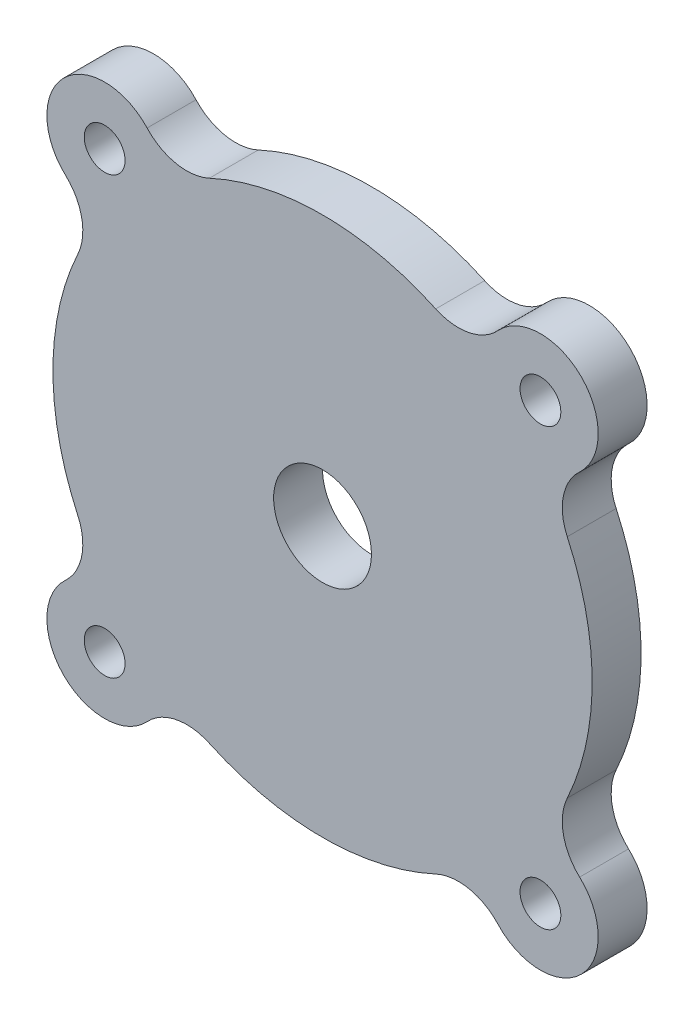
ISO-10303-21;
HEADER;
FILE_DESCRIPTION(('STEP AP214'),'2;1');
FILE_NAME('part.step','',(''),(''),'','','');
FILE_SCHEMA(('AUTOMOTIVE_DESIGN { 1 0 10303 214 1 1 1 1 }'));
ENDSEC;
DATA;
#1=APPLICATION_CONTEXT('core data for automotive mechanical design processes');
#2=APPLICATION_PROTOCOL_DEFINITION('international standard','automotive_design',2000,#1);
#3=PRODUCT_CONTEXT('',#1,'mechanical');
#4=PRODUCT('Part','Part','',(#3));
#5=PRODUCT_RELATED_PRODUCT_CATEGORY('part','',(#4));
#6=PRODUCT_DEFINITION_FORMATION('','',#4);
#7=PRODUCT_DEFINITION_CONTEXT('part definition',#1,'design');
#8=PRODUCT_DEFINITION('design','',#6,#7);
#9=PRODUCT_DEFINITION_SHAPE('','',#8);
#10=(LENGTH_UNIT() NAMED_UNIT(*) SI_UNIT(.MILLI.,.METRE.));
#11=(NAMED_UNIT(*) PLANE_ANGLE_UNIT() SI_UNIT($,.RADIAN.));
#12=(NAMED_UNIT(*) SI_UNIT($,.STERADIAN.) SOLID_ANGLE_UNIT());
#13=UNCERTAINTY_MEASURE_WITH_UNIT(LENGTH_MEASURE(1.E-05),#10,'distance_accuracy_value','');
#14=(GEOMETRIC_REPRESENTATION_CONTEXT(3) GLOBAL_UNCERTAINTY_ASSIGNED_CONTEXT((#13)) GLOBAL_UNIT_ASSIGNED_CONTEXT((#10,
#11,#12)) REPRESENTATION_CONTEXT('',''));
#15=CARTESIAN_POINT('',(0.,0.,0.));
#16=DIRECTION('',(0.,0.,1.));
#17=DIRECTION('',(1.,0.,0.));
#18=AXIS2_PLACEMENT_3D('',#15,#16,#17);
#19=CARTESIAN_POINT('',(0.,0.,3.175));
#20=DIRECTION('',(0.,0.,-1.));
#21=DIRECTION('',(-1.,0.,0.));
#22=AXIS2_PLACEMENT_3D('',#19,#20,#21);
#23=CYLINDRICAL_SURFACE('',#22,35.);
#24=CARTESIAN_POINT('',(0.,0.,3.175));
#25=DIRECTION('',(0.,0.,1.));
#26=DIRECTION('',(-1.,0.,0.));
#27=AXIS2_PLACEMENT_3D('',#24,#25,#26);
#28=CIRCLE('',#27,35.);
#29=CARTESIAN_POINT('',(14.6921496209077,31.7669756117396,3.175));
#30=VERTEX_POINT('',#29);
#31=CARTESIAN_POINT('',(-14.6921496209078,31.7669756117396,3.175));
#32=VERTEX_POINT('',#31);
#33=EDGE_CURVE('E197',#30,#32,#28,.T.);
#34=ORIENTED_EDGE('',*,*,#33,.F.);
#35=DIRECTION('',(0.,0.,-1.));
#36=VECTOR('',#35,1.);
#37=CARTESIAN_POINT('',(14.6921496209077,31.7669756117396,3.175));
#38=LINE('',#37,#36);
#39=CARTESIAN_POINT('',(14.6921496209077,31.7669756117396,-3.175));
#40=VERTEX_POINT('',#39);
#41=EDGE_CURVE('E159',#30,#40,#38,.T.);
#42=ORIENTED_EDGE('',*,*,#41,.T.);
#43=CARTESIAN_POINT('',(0.,0.,-3.175));
#44=DIRECTION('',(0.,0.,1.));
#45=DIRECTION('',(-1.,0.,0.));
#46=AXIS2_PLACEMENT_3D('',#43,#44,#45);
#47=CIRCLE('',#46,35.);
#48=CARTESIAN_POINT('',(-14.6921496209078,31.7669756117396,-3.175));
#49=VERTEX_POINT('',#48);
#50=EDGE_CURVE('E182',#40,#49,#47,.T.);
#51=ORIENTED_EDGE('',*,*,#50,.T.);
#52=DIRECTION('',(0.,0.,-1.));
#53=VECTOR('',#52,1.);
#54=CARTESIAN_POINT('',(-14.6921496209078,31.7669756117396,3.175));
#55=LINE('',#54,#53);
#56=EDGE_CURVE('E49',#49,#32,#55,.F.);
#57=ORIENTED_EDGE('',*,*,#56,.T.);
#58=EDGE_LOOP('',(#34,#42,#51,#57));
#59=FACE_BOUND('',#58,.T.);
#60=ADVANCED_FACE('F34',(#59),#23,.T.);
#61=CARTESIAN_POINT('',(-28.2842712474619,28.2842712474619,3.175));
#62=DIRECTION('',(0.,0.,-1.));
#63=DIRECTION('',(-1.,0.,0.));
#64=AXIS2_PLACEMENT_3D('',#61,#62,#63);
#65=CYLINDRICAL_SURFACE('',#64,7.50000000000001);
#66=CARTESIAN_POINT('',(-28.2842712474619,28.2842712474619,-3.175));
#67=DIRECTION('',(0.,0.,1.));
#68=DIRECTION('',(1.,0.,0.));
#69=AXIS2_PLACEMENT_3D('',#66,#67,#68);
#70=CIRCLE('',#69,7.50000000000001);
#71=CARTESIAN_POINT('',(-22.7737410565795,33.3719089129579,-3.175));
#72=VERTEX_POINT('',#71);
#73=CARTESIAN_POINT('',(-33.3719089129579,22.7737410565795,-3.175));
#74=VERTEX_POINT('',#73);
#75=EDGE_CURVE('E177',#72,#74,#70,.T.);
#76=ORIENTED_EDGE('',*,*,#75,.T.);
#77=DIRECTION('',(0.,0.,-1.));
#78=VECTOR('',#77,1.);
#79=CARTESIAN_POINT('',(-33.3719089129579,22.7737410565795,3.175));
#80=LINE('',#79,#78);
#81=CARTESIAN_POINT('',(-33.3719089129579,22.7737410565795,3.175));
#82=VERTEX_POINT('',#81);
#83=EDGE_CURVE('E153',#74,#82,#80,.F.);
#84=ORIENTED_EDGE('',*,*,#83,.T.);
#85=CARTESIAN_POINT('',(-28.2842712474619,28.2842712474619,3.175));
#86=DIRECTION('',(0.,0.,1.));
#87=DIRECTION('',(1.,0.,0.));
#88=AXIS2_PLACEMENT_3D('',#85,#86,#87);
#89=CIRCLE('',#88,7.50000000000001);
#90=CARTESIAN_POINT('',(-22.7737410565795,33.3719089129579,3.175));
#91=VERTEX_POINT('',#90);
#92=EDGE_CURVE('E261',#91,#82,#89,.T.);
#93=ORIENTED_EDGE('',*,*,#92,.F.);
#94=DIRECTION('',(0.,0.,-1.));
#95=VECTOR('',#94,1.);
#96=CARTESIAN_POINT('',(-22.7737410565795,33.3719089129579,3.175));
#97=LINE('',#96,#95);
#98=EDGE_CURVE('E169',#91,#72,#97,.T.);
#99=ORIENTED_EDGE('',*,*,#98,.T.);
#100=EDGE_LOOP('',(#76,#84,#93,#99));
#101=FACE_BOUND('',#100,.T.);
#102=ADVANCED_FACE('F263',(#101),#65,.T.);
#103=CARTESIAN_POINT('',(0.,0.,3.175));
#104=DIRECTION('',(0.,0.,-1.));
#105=DIRECTION('',(-1.,0.,0.));
#106=AXIS2_PLACEMENT_3D('',#103,#104,#105);
#107=CYLINDRICAL_SURFACE('',#106,35.);
#108=CARTESIAN_POINT('',(0.,0.,3.175));
#109=DIRECTION('',(0.,0.,1.));
#110=DIRECTION('',(-1.,0.,0.));
#111=AXIS2_PLACEMENT_3D('',#108,#109,#110);
#112=CIRCLE('',#111,35.);
#113=CARTESIAN_POINT('',(-31.7669756117396,14.6921496209078,3.175));
#114=VERTEX_POINT('',#113);
#115=CARTESIAN_POINT('',(-31.7669756117396,-14.6921496209078,3.175));
#116=VERTEX_POINT('',#115);
#117=EDGE_CURVE('E168',#114,#116,#112,.T.);
#118=ORIENTED_EDGE('',*,*,#117,.F.);
#119=DIRECTION('',(0.,0.,-1.));
#120=VECTOR('',#119,1.);
#121=CARTESIAN_POINT('',(-31.7669756117396,14.6921496209078,3.175));
#122=LINE('',#121,#120);
#123=CARTESIAN_POINT('',(-31.7669756117396,14.6921496209078,-3.175));
#124=VERTEX_POINT('',#123);
#125=EDGE_CURVE('E152',#114,#124,#122,.T.);
#126=ORIENTED_EDGE('',*,*,#125,.T.);
#127=CARTESIAN_POINT('',(0.,0.,-3.175));
#128=DIRECTION('',(0.,0.,1.));
#129=DIRECTION('',(-1.,0.,0.));
#130=AXIS2_PLACEMENT_3D('',#127,#128,#129);
#131=CIRCLE('',#130,35.);
#132=CARTESIAN_POINT('',(-31.7669756117396,-14.6921496209078,-3.175));
#133=VERTEX_POINT('',#132);
#134=EDGE_CURVE('E165',#124,#133,#131,.T.);
#135=ORIENTED_EDGE('',*,*,#134,.T.);
#136=DIRECTION('',(0.,0.,-1.));
#137=VECTOR('',#136,1.);
#138=CARTESIAN_POINT('',(-31.7669756117396,-14.6921496209078,3.175));
#139=LINE('',#138,#137);
#140=EDGE_CURVE('E170',#133,#116,#139,.F.);
#141=ORIENTED_EDGE('',*,*,#140,.T.);
#142=EDGE_LOOP('',(#118,#126,#135,#141));
#143=FACE_BOUND('',#142,.T.);
#144=ADVANCED_FACE('F164',(#143),#107,.T.);
#145=CARTESIAN_POINT('',(-28.2842712474619,-28.2842712474619,3.175));
#146=DIRECTION('',(0.,0.,-1.));
#147=DIRECTION('',(-1.,0.,0.));
#148=AXIS2_PLACEMENT_3D('',#145,#146,#147);
#149=CYLINDRICAL_SURFACE('',#148,7.50000000000001);
#150=CARTESIAN_POINT('',(-28.2842712474619,-28.2842712474619,3.175));
#151=DIRECTION('',(0.,0.,1.));
#152=DIRECTION('',(1.,0.,0.));
#153=AXIS2_PLACEMENT_3D('',#150,#151,#152);
#154=CIRCLE('',#153,7.50000000000001);
#155=CARTESIAN_POINT('',(-33.3719089129579,-22.7737410565795,3.175));
#156=VERTEX_POINT('',#155);
#157=CARTESIAN_POINT('',(-22.7737410565795,-33.3719089129579,3.175));
#158=VERTEX_POINT('',#157);
#159=EDGE_CURVE('E265',#156,#158,#154,.T.);
#160=ORIENTED_EDGE('',*,*,#159,.F.);
#161=DIRECTION('',(0.,0.,-1.));
#162=VECTOR('',#161,1.);
#163=CARTESIAN_POINT('',(-33.3719089129579,-22.7737410565795,3.175));
#164=LINE('',#163,#162);
#165=CARTESIAN_POINT('',(-33.3719089129579,-22.7737410565795,-3.175));
#166=VERTEX_POINT('',#165);
#167=EDGE_CURVE('E205',#156,#166,#164,.T.);
#168=ORIENTED_EDGE('',*,*,#167,.T.);
#169=CARTESIAN_POINT('',(-28.2842712474619,-28.2842712474619,-3.175));
#170=DIRECTION('',(0.,0.,1.));
#171=DIRECTION('',(1.,0.,0.));
#172=AXIS2_PLACEMENT_3D('',#169,#170,#171);
#173=CIRCLE('',#172,7.50000000000001);
#174=CARTESIAN_POINT('',(-22.7737410565795,-33.3719089129579,-3.175));
#175=VERTEX_POINT('',#174);
#176=EDGE_CURVE('E176',#166,#175,#173,.T.);
#177=ORIENTED_EDGE('',*,*,#176,.T.);
#178=DIRECTION('',(0.,0.,-1.));
#179=VECTOR('',#178,1.);
#180=CARTESIAN_POINT('',(-22.7737410565795,-33.3719089129579,3.175));
#181=LINE('',#180,#179);
#182=EDGE_CURVE('E203',#175,#158,#181,.F.);
#183=ORIENTED_EDGE('',*,*,#182,.T.);
#184=EDGE_LOOP('',(#160,#168,#177,#183));
#185=FACE_BOUND('',#184,.T.);
#186=ADVANCED_FACE('F322',(#185),#149,.T.);
#187=CARTESIAN_POINT('',(0.,0.,3.175));
#188=DIRECTION('',(0.,0.,-1.));
#189=DIRECTION('',(-1.,0.,0.));
#190=AXIS2_PLACEMENT_3D('',#187,#188,#189);
#191=CYLINDRICAL_SURFACE('',#190,35.);
#192=CARTESIAN_POINT('',(0.,0.,3.175));
#193=DIRECTION('',(0.,0.,1.));
#194=DIRECTION('',(-1.,0.,0.));
#195=AXIS2_PLACEMENT_3D('',#192,#193,#194);
#196=CIRCLE('',#195,35.);
#197=CARTESIAN_POINT('',(-14.6921496209077,-31.7669756117396,3.175));
#198=VERTEX_POINT('',#197);
#199=CARTESIAN_POINT('',(14.6921496209077,-31.7669756117396,3.175));
#200=VERTEX_POINT('',#199);
#201=EDGE_CURVE('E272',#198,#200,#196,.T.);
#202=ORIENTED_EDGE('',*,*,#201,.F.);
#203=DIRECTION('',(0.,0.,-1.));
#204=VECTOR('',#203,1.);
#205=CARTESIAN_POINT('',(-14.6921496209077,-31.7669756117396,3.175));
#206=LINE('',#205,#204);
#207=CARTESIAN_POINT('',(-14.6921496209077,-31.7669756117396,-3.175));
#208=VERTEX_POINT('',#207);
#209=EDGE_CURVE('E210',#198,#208,#206,.T.);
#210=ORIENTED_EDGE('',*,*,#209,.T.);
#211=CARTESIAN_POINT('',(0.,0.,-3.175));
#212=DIRECTION('',(0.,0.,1.));
#213=DIRECTION('',(-1.,0.,0.));
#214=AXIS2_PLACEMENT_3D('',#211,#212,#213);
#215=CIRCLE('',#214,35.);
#216=CARTESIAN_POINT('',(14.6921496209077,-31.7669756117396,-3.175));
#217=VERTEX_POINT('',#216);
#218=EDGE_CURVE('E180',#208,#217,#215,.T.);
#219=ORIENTED_EDGE('',*,*,#218,.T.);
#220=DIRECTION('',(0.,0.,-1.));
#221=VECTOR('',#220,1.);
#222=CARTESIAN_POINT('',(14.6921496209078,-31.7669756117396,3.175));
#223=LINE('',#222,#221);
#224=EDGE_CURVE('E208',#217,#200,#223,.F.);
#225=ORIENTED_EDGE('',*,*,#224,.T.);
#226=EDGE_LOOP('',(#202,#210,#219,#225));
#227=FACE_BOUND('',#226,.T.);
#228=ADVANCED_FACE('F314',(#227),#191,.T.);
#229=CARTESIAN_POINT('',(28.2842712474619,-28.2842712474619,3.175));
#230=DIRECTION('',(0.,0.,-1.));
#231=DIRECTION('',(-1.,0.,0.));
#232=AXIS2_PLACEMENT_3D('',#229,#230,#231);
#233=CYLINDRICAL_SURFACE('',#232,7.50000000000001);
#234=CARTESIAN_POINT('',(28.2842712474619,-28.2842712474619,3.175));
#235=DIRECTION('',(0.,0.,1.));
#236=DIRECTION('',(1.,0.,0.));
#237=AXIS2_PLACEMENT_3D('',#234,#235,#236);
#238=CIRCLE('',#237,7.50000000000001);
#239=CARTESIAN_POINT('',(22.7737410565795,-33.3719089129579,3.175));
#240=VERTEX_POINT('',#239);
#241=CARTESIAN_POINT('',(33.3719089129579,-22.7737410565795,3.175));
#242=VERTEX_POINT('',#241);
#243=EDGE_CURVE('E275',#240,#242,#238,.T.);
#244=ORIENTED_EDGE('',*,*,#243,.F.);
#245=DIRECTION('',(0.,0.,-1.));
#246=VECTOR('',#245,1.);
#247=CARTESIAN_POINT('',(22.7737410565795,-33.3719089129579,3.175));
#248=LINE('',#247,#246);
#249=CARTESIAN_POINT('',(22.7737410565795,-33.3719089129579,-3.175));
#250=VERTEX_POINT('',#249);
#251=EDGE_CURVE('E215',#240,#250,#248,.T.);
#252=ORIENTED_EDGE('',*,*,#251,.T.);
#253=CARTESIAN_POINT('',(28.2842712474619,-28.2842712474619,-3.175));
#254=DIRECTION('',(0.,0.,1.));
#255=DIRECTION('',(1.,0.,0.));
#256=AXIS2_PLACEMENT_3D('',#253,#254,#255);
#257=CIRCLE('',#256,7.50000000000001);
#258=CARTESIAN_POINT('',(33.3719089129579,-22.7737410565795,-3.175));
#259=VERTEX_POINT('',#258);
#260=EDGE_CURVE('E188',#250,#259,#257,.T.);
#261=ORIENTED_EDGE('',*,*,#260,.T.);
#262=DIRECTION('',(0.,0.,-1.));
#263=VECTOR('',#262,1.);
#264=CARTESIAN_POINT('',(33.3719089129579,-22.7737410565795,3.175));
#265=LINE('',#264,#263);
#266=EDGE_CURVE('E213',#259,#242,#265,.F.);
#267=ORIENTED_EDGE('',*,*,#266,.T.);
#268=EDGE_LOOP('',(#244,#252,#261,#267));
#269=FACE_BOUND('',#268,.T.);
#270=ADVANCED_FACE('F305',(#269),#233,.T.);
#271=CARTESIAN_POINT('',(0.,0.,3.175));
#272=DIRECTION('',(0.,0.,-1.));
#273=DIRECTION('',(-1.,0.,0.));
#274=AXIS2_PLACEMENT_3D('',#271,#272,#273);
#275=CYLINDRICAL_SURFACE('',#274,35.);
#276=CARTESIAN_POINT('',(0.,0.,3.175));
#277=DIRECTION('',(0.,0.,1.));
#278=DIRECTION('',(-1.,0.,0.));
#279=AXIS2_PLACEMENT_3D('',#276,#277,#278);
#280=CIRCLE('',#279,35.);
#281=CARTESIAN_POINT('',(31.7669756117396,-14.6921496209078,3.175));
#282=VERTEX_POINT('',#281);
#283=CARTESIAN_POINT('',(31.7669756117396,14.6921496209078,3.175));
#284=VERTEX_POINT('',#283);
#285=EDGE_CURVE('E278',#282,#284,#280,.T.);
#286=ORIENTED_EDGE('',*,*,#285,.F.);
#287=DIRECTION('',(0.,0.,-1.));
#288=VECTOR('',#287,1.);
#289=CARTESIAN_POINT('',(31.7669756117396,-14.6921496209078,3.175));
#290=LINE('',#289,#288);
#291=CARTESIAN_POINT('',(31.7669756117396,-14.6921496209078,-3.175));
#292=VERTEX_POINT('',#291);
#293=EDGE_CURVE('E220',#282,#292,#290,.T.);
#294=ORIENTED_EDGE('',*,*,#293,.T.);
#295=CARTESIAN_POINT('',(0.,0.,-3.175));
#296=DIRECTION('',(0.,0.,1.));
#297=DIRECTION('',(-1.,0.,0.));
#298=AXIS2_PLACEMENT_3D('',#295,#296,#297);
#299=CIRCLE('',#298,35.);
#300=CARTESIAN_POINT('',(31.7669756117396,14.6921496209078,-3.175));
#301=VERTEX_POINT('',#300);
#302=EDGE_CURVE('E191',#292,#301,#299,.T.);
#303=ORIENTED_EDGE('',*,*,#302,.T.);
#304=DIRECTION('',(0.,0.,-1.));
#305=VECTOR('',#304,1.);
#306=CARTESIAN_POINT('',(31.7669756117396,14.6921496209078,3.175));
#307=LINE('',#306,#305);
#308=EDGE_CURVE('E218',#301,#284,#307,.F.);
#309=ORIENTED_EDGE('',*,*,#308,.T.);
#310=EDGE_LOOP('',(#286,#294,#303,#309));
#311=FACE_BOUND('',#310,.T.);
#312=ADVANCED_FACE('F296',(#311),#275,.T.);
#313=CARTESIAN_POINT('',(28.2842712474619,28.2842712474619,3.175));
#314=DIRECTION('',(0.,0.,-1.));
#315=DIRECTION('',(-1.,0.,0.));
#316=AXIS2_PLACEMENT_3D('',#313,#314,#315);
#317=CYLINDRICAL_SURFACE('',#316,7.5);
#318=CARTESIAN_POINT('',(28.2842712474619,28.2842712474619,3.175));
#319=DIRECTION('',(0.,0.,1.));
#320=DIRECTION('',(1.,0.,0.));
#321=AXIS2_PLACEMENT_3D('',#318,#319,#320);
#322=CIRCLE('',#321,7.5);
#323=CARTESIAN_POINT('',(33.3719089129579,22.7737410565795,3.175));
#324=VERTEX_POINT('',#323);
#325=CARTESIAN_POINT('',(22.7737410565795,33.3719089129579,3.175));
#326=VERTEX_POINT('',#325);
#327=EDGE_CURVE('E198',#324,#326,#322,.T.);
#328=ORIENTED_EDGE('',*,*,#327,.F.);
#329=DIRECTION('',(0.,0.,-1.));
#330=VECTOR('',#329,1.);
#331=CARTESIAN_POINT('',(33.3719089129579,22.7737410565795,3.175));
#332=LINE('',#331,#330);
#333=CARTESIAN_POINT('',(33.3719089129579,22.7737410565795,-3.175));
#334=VERTEX_POINT('',#333);
#335=EDGE_CURVE('E225',#324,#334,#332,.T.);
#336=ORIENTED_EDGE('',*,*,#335,.T.);
#337=CARTESIAN_POINT('',(28.2842712474619,28.2842712474619,-3.175));
#338=DIRECTION('',(0.,0.,1.));
#339=DIRECTION('',(1.,0.,0.));
#340=AXIS2_PLACEMENT_3D('',#337,#338,#339);
#341=CIRCLE('',#340,7.5);
#342=CARTESIAN_POINT('',(22.7737410565795,33.3719089129579,-3.175));
#343=VERTEX_POINT('',#342);
#344=EDGE_CURVE('E194',#334,#343,#341,.T.);
#345=ORIENTED_EDGE('',*,*,#344,.T.);
#346=DIRECTION('',(0.,0.,-1.));
#347=VECTOR('',#346,1.);
#348=CARTESIAN_POINT('',(22.7737410565795,33.3719089129579,3.175));
#349=LINE('',#348,#347);
#350=EDGE_CURVE('E223',#343,#326,#349,.F.);
#351=ORIENTED_EDGE('',*,*,#350,.T.);
#352=EDGE_LOOP('',(#328,#336,#345,#351));
#353=FACE_BOUND('',#352,.T.);
#354=ADVANCED_FACE('F289',(#353),#317,.T.);
#355=CARTESIAN_POINT('',(14.1421356237309,14.142135623731,3.175));
#356=DIRECTION('',(0.,0.,-1.));
#357=DIRECTION('',(-1.,0.,0.));
#358=AXIS2_PLACEMENT_3D('',#355,#356,#357);
#359=PLANE('',#358);
#360=CARTESIAN_POINT('',(0.,0.,3.175));
#361=DIRECTION('',(0.,0.,1.));
#362=DIRECTION('',(1.,0.,0.));
#363=AXIS2_PLACEMENT_3D('',#360,#361,#362);
#364=CIRCLE('',#363,6.35);
#365=CARTESIAN_POINT('',(6.35,0.,3.175));
#366=VERTEX_POINT('',#365);
#367=EDGE_CURVE('E387',#366,#366,#364,.T.);
#368=ORIENTED_EDGE('',*,*,#367,.F.);
#369=EDGE_LOOP('',(#368));
#370=FACE_BOUND('',#369,.T.);
#371=CARTESIAN_POINT('',(-28.2842712474619,28.2842712474619,3.175));
#372=DIRECTION('',(0.,0.,1.));
#373=DIRECTION('',(1.,0.,0.));
#374=AXIS2_PLACEMENT_3D('',#371,#372,#373);
#375=CIRCLE('',#374,2.64999999999999);
#376=CARTESIAN_POINT('',(-25.6342712474619,28.2842712474619,3.175));
#377=VERTEX_POINT('',#376);
#378=EDGE_CURVE('E389',#377,#377,#375,.T.);
#379=ORIENTED_EDGE('',*,*,#378,.F.);
#380=EDGE_LOOP('',(#379));
#381=FACE_BOUND('',#380,.T.);
#382=CARTESIAN_POINT('',(28.2842712474619,28.2842712474619,3.175));
#383=DIRECTION('',(0.,0.,1.));
#384=DIRECTION('',(1.,0.,0.));
#385=AXIS2_PLACEMENT_3D('',#382,#383,#384);
#386=CIRCLE('',#385,2.64999999999999);
#387=CARTESIAN_POINT('',(30.9342712474619,28.2842712474619,3.175));
#388=VERTEX_POINT('',#387);
#389=EDGE_CURVE('E397',#388,#388,#386,.T.);
#390=ORIENTED_EDGE('',*,*,#389,.F.);
#391=EDGE_LOOP('',(#390));
#392=FACE_BOUND('',#391,.T.);
#393=CARTESIAN_POINT('',(28.2842712474619,-28.2842712474619,3.175));
#394=DIRECTION('',(0.,0.,1.));
#395=DIRECTION('',(1.,0.,0.));
#396=AXIS2_PLACEMENT_3D('',#393,#394,#395);
#397=CIRCLE('',#396,2.64999999999999);
#398=CARTESIAN_POINT('',(30.9342712474619,-28.2842712474619,3.175));
#399=VERTEX_POINT('',#398);
#400=EDGE_CURVE('E403',#399,#399,#397,.T.);
#401=ORIENTED_EDGE('',*,*,#400,.F.);
#402=EDGE_LOOP('',(#401));
#403=FACE_BOUND('',#402,.T.);
#404=CARTESIAN_POINT('',(-28.2842712474619,-28.2842712474619,3.175));
#405=DIRECTION('',(0.,0.,1.));
#406=DIRECTION('',(1.,0.,0.));
#407=AXIS2_PLACEMENT_3D('',#404,#405,#406);
#408=CIRCLE('',#407,2.64999999999999);
#409=CARTESIAN_POINT('',(-25.6342712474619,-28.2842712474619,3.175));
#410=VERTEX_POINT('',#409);
#411=EDGE_CURVE('E409',#410,#410,#408,.T.);
#412=ORIENTED_EDGE('',*,*,#411,.F.);
#413=EDGE_LOOP('',(#412));
#414=FACE_BOUND('',#413,.T.);
#415=ORIENTED_EDGE('',*,*,#327,.T.);
#416=CARTESIAN_POINT('',(17.6305795450893,38.1203707340876,3.175));
#417=DIRECTION('',(0.,0.,-1.));
#418=DIRECTION('',(-1.,0.,0.));
#419=AXIS2_PLACEMENT_3D('',#416,#417,#418);
#420=CIRCLE('',#419,7.);
#421=EDGE_CURVE('E56',#326,#30,#420,.T.);
#422=ORIENTED_EDGE('',*,*,#421,.T.);
#423=ORIENTED_EDGE('',*,*,#33,.T.);
#424=CARTESIAN_POINT('',(-17.6305795450893,38.1203707340876,3.175));
#425=DIRECTION('',(0.,0.,-1.));
#426=DIRECTION('',(-1.,0.,0.));
#427=AXIS2_PLACEMENT_3D('',#424,#425,#426);
#428=CIRCLE('',#427,7.);
#429=EDGE_CURVE('E11',#32,#91,#428,.T.);
#430=ORIENTED_EDGE('',*,*,#429,.T.);
#431=ORIENTED_EDGE('',*,*,#92,.T.);
#432=CARTESIAN_POINT('',(-38.1203707340876,17.6305795450893,3.175));
#433=DIRECTION('',(0.,0.,-1.));
#434=DIRECTION('',(-1.,0.,0.));
#435=AXIS2_PLACEMENT_3D('',#432,#433,#434);
#436=CIRCLE('',#435,7.);
#437=EDGE_CURVE('E158',#82,#114,#436,.T.);
#438=ORIENTED_EDGE('',*,*,#437,.T.);
#439=ORIENTED_EDGE('',*,*,#117,.T.);
#440=CARTESIAN_POINT('',(-38.1203707340876,-17.6305795450893,3.175));
#441=DIRECTION('',(0.,0.,-1.));
#442=DIRECTION('',(-1.,0.,0.));
#443=AXIS2_PLACEMENT_3D('',#440,#441,#442);
#444=CIRCLE('',#443,7.);
#445=EDGE_CURVE('E233',#116,#156,#444,.T.);
#446=ORIENTED_EDGE('',*,*,#445,.T.);
#447=ORIENTED_EDGE('',*,*,#159,.T.);
#448=CARTESIAN_POINT('',(-17.6305795450893,-38.1203707340876,3.175));
#449=DIRECTION('',(0.,0.,-1.));
#450=DIRECTION('',(-1.,0.,0.));
#451=AXIS2_PLACEMENT_3D('',#448,#449,#450);
#452=CIRCLE('',#451,7.);
#453=EDGE_CURVE('E237',#158,#198,#452,.T.);
#454=ORIENTED_EDGE('',*,*,#453,.T.);
#455=ORIENTED_EDGE('',*,*,#201,.T.);
#456=CARTESIAN_POINT('',(17.6305795450893,-38.1203707340876,3.175));
#457=DIRECTION('',(0.,0.,-1.));
#458=DIRECTION('',(-1.,0.,0.));
#459=AXIS2_PLACEMENT_3D('',#456,#457,#458);
#460=CIRCLE('',#459,7.);
#461=EDGE_CURVE('E241',#200,#240,#460,.T.);
#462=ORIENTED_EDGE('',*,*,#461,.T.);
#463=ORIENTED_EDGE('',*,*,#243,.T.);
#464=CARTESIAN_POINT('',(38.1203707340875,-17.6305795450893,3.175));
#465=DIRECTION('',(0.,0.,-1.));
#466=DIRECTION('',(-1.,0.,0.));
#467=AXIS2_PLACEMENT_3D('',#464,#465,#466);
#468=CIRCLE('',#467,7.);
#469=EDGE_CURVE('E245',#242,#282,#468,.T.);
#470=ORIENTED_EDGE('',*,*,#469,.T.);
#471=ORIENTED_EDGE('',*,*,#285,.T.);
#472=CARTESIAN_POINT('',(38.1203707340875,17.6305795450893,3.175));
#473=DIRECTION('',(0.,0.,-1.));
#474=DIRECTION('',(-1.,0.,0.));
#475=AXIS2_PLACEMENT_3D('',#472,#473,#474);
#476=CIRCLE('',#475,7.);
#477=EDGE_CURVE('E249',#284,#324,#476,.T.);
#478=ORIENTED_EDGE('',*,*,#477,.T.);
#479=EDGE_LOOP('',(#415,#422,#423,#430,#431,#438,#439,#446,#447,#454,#455,#462,#463,#470,#471,#478));
#480=FACE_BOUND('',#479,.T.);
#481=ADVANCED_FACE('F260',(#370,#381,#392,#403,#414,#480),#359,.F.);
#482=CARTESIAN_POINT('',(14.1421356237309,14.142135623731,-3.175));
#483=DIRECTION('',(0.,0.,-1.));
#484=DIRECTION('',(-1.,0.,0.));
#485=AXIS2_PLACEMENT_3D('',#482,#483,#484);
#486=PLANE('',#485);
#487=CARTESIAN_POINT('',(0.,0.,-3.175));
#488=DIRECTION('',(0.,0.,1.));
#489=DIRECTION('',(1.,0.,0.));
#490=AXIS2_PLACEMENT_3D('',#487,#488,#489);
#491=CIRCLE('',#490,6.35);
#492=CARTESIAN_POINT('',(6.35,0.,-3.175));
#493=VERTEX_POINT('',#492);
#494=EDGE_CURVE('E384',#493,#493,#491,.T.);
#495=ORIENTED_EDGE('',*,*,#494,.T.);
#496=EDGE_LOOP('',(#495));
#497=FACE_BOUND('',#496,.T.);
#498=CARTESIAN_POINT('',(-28.2842712474619,28.2842712474619,-3.17499999999999));
#499=DIRECTION('',(0.,0.,1.));
#500=DIRECTION('',(1.,0.,0.));
#501=AXIS2_PLACEMENT_3D('',#498,#499,#500);
#502=CIRCLE('',#501,2.64999999999999);
#503=CARTESIAN_POINT('',(-25.6342712474619,28.2842712474619,-3.17499999999999));
#504=VERTEX_POINT('',#503);
#505=EDGE_CURVE('E394',#504,#504,#502,.T.);
#506=ORIENTED_EDGE('',*,*,#505,.T.);
#507=EDGE_LOOP('',(#506));
#508=FACE_BOUND('',#507,.T.);
#509=CARTESIAN_POINT('',(28.2842712474619,28.2842712474619,-3.17499999999999));
#510=DIRECTION('',(0.,0.,1.));
#511=DIRECTION('',(1.,0.,0.));
#512=AXIS2_PLACEMENT_3D('',#509,#510,#511);
#513=CIRCLE('',#512,2.64999999999999);
#514=CARTESIAN_POINT('',(30.9342712474619,28.2842712474619,-3.17499999999999));
#515=VERTEX_POINT('',#514);
#516=EDGE_CURVE('E400',#515,#515,#513,.T.);
#517=ORIENTED_EDGE('',*,*,#516,.T.);
#518=EDGE_LOOP('',(#517));
#519=FACE_BOUND('',#518,.T.);
#520=CARTESIAN_POINT('',(28.2842712474619,-28.2842712474619,-3.17499999999999));
#521=DIRECTION('',(0.,0.,1.));
#522=DIRECTION('',(1.,0.,0.));
#523=AXIS2_PLACEMENT_3D('',#520,#521,#522);
#524=CIRCLE('',#523,2.64999999999999);
#525=CARTESIAN_POINT('',(30.9342712474619,-28.2842712474619,-3.17499999999999));
#526=VERTEX_POINT('',#525);
#527=EDGE_CURVE('E406',#526,#526,#524,.T.);
#528=ORIENTED_EDGE('',*,*,#527,.T.);
#529=EDGE_LOOP('',(#528));
#530=FACE_BOUND('',#529,.T.);
#531=CARTESIAN_POINT('',(-28.2842712474619,-28.2842712474619,-3.17499999999999));
#532=DIRECTION('',(0.,0.,1.));
#533=DIRECTION('',(1.,0.,0.));
#534=AXIS2_PLACEMENT_3D('',#531,#532,#533);
#535=CIRCLE('',#534,2.64999999999999);
#536=CARTESIAN_POINT('',(-25.6342712474619,-28.2842712474619,-3.17499999999999));
#537=VERTEX_POINT('',#536);
#538=EDGE_CURVE('E256',#537,#537,#535,.T.);
#539=ORIENTED_EDGE('',*,*,#538,.T.);
#540=EDGE_LOOP('',(#539));
#541=FACE_BOUND('',#540,.T.);
#542=ORIENTED_EDGE('',*,*,#50,.F.);
#543=CARTESIAN_POINT('',(17.6305795450893,38.1203707340876,-3.175));
#544=DIRECTION('',(0.,0.,-1.));
#545=DIRECTION('',(-1.,0.,0.));
#546=AXIS2_PLACEMENT_3D('',#543,#544,#545);
#547=CIRCLE('',#546,7.);
#548=EDGE_CURVE('E251',#40,#343,#547,.F.);
#549=ORIENTED_EDGE('',*,*,#548,.T.);
#550=ORIENTED_EDGE('',*,*,#344,.F.);
#551=CARTESIAN_POINT('',(38.1203707340875,17.6305795450893,-3.175));
#552=DIRECTION('',(0.,0.,-1.));
#553=DIRECTION('',(-1.,0.,0.));
#554=AXIS2_PLACEMENT_3D('',#551,#552,#553);
#555=CIRCLE('',#554,7.);
#556=EDGE_CURVE('E247',#334,#301,#555,.F.);
#557=ORIENTED_EDGE('',*,*,#556,.T.);
#558=ORIENTED_EDGE('',*,*,#302,.F.);
#559=CARTESIAN_POINT('',(38.1203707340875,-17.6305795450893,-3.175));
#560=DIRECTION('',(0.,0.,-1.));
#561=DIRECTION('',(-1.,0.,0.));
#562=AXIS2_PLACEMENT_3D('',#559,#560,#561);
#563=CIRCLE('',#562,7.);
#564=EDGE_CURVE('E243',#292,#259,#563,.F.);
#565=ORIENTED_EDGE('',*,*,#564,.T.);
#566=ORIENTED_EDGE('',*,*,#260,.F.);
#567=CARTESIAN_POINT('',(17.6305795450893,-38.1203707340876,-3.175));
#568=DIRECTION('',(0.,0.,-1.));
#569=DIRECTION('',(-1.,0.,0.));
#570=AXIS2_PLACEMENT_3D('',#567,#568,#569);
#571=CIRCLE('',#570,7.);
#572=EDGE_CURVE('E239',#250,#217,#571,.F.);
#573=ORIENTED_EDGE('',*,*,#572,.T.);
#574=ORIENTED_EDGE('',*,*,#218,.F.);
#575=CARTESIAN_POINT('',(-17.6305795450893,-38.1203707340876,-3.175));
#576=DIRECTION('',(0.,0.,-1.));
#577=DIRECTION('',(-1.,0.,0.));
#578=AXIS2_PLACEMENT_3D('',#575,#576,#577);
#579=CIRCLE('',#578,7.);
#580=EDGE_CURVE('E235',#208,#175,#579,.F.);
#581=ORIENTED_EDGE('',*,*,#580,.T.);
#582=ORIENTED_EDGE('',*,*,#176,.F.);
#583=CARTESIAN_POINT('',(-38.1203707340876,-17.6305795450893,-3.175));
#584=DIRECTION('',(0.,0.,-1.));
#585=DIRECTION('',(-1.,0.,0.));
#586=AXIS2_PLACEMENT_3D('',#583,#584,#585);
#587=CIRCLE('',#586,7.);
#588=EDGE_CURVE('E175',#166,#133,#587,.F.);
#589=ORIENTED_EDGE('',*,*,#588,.T.);
#590=ORIENTED_EDGE('',*,*,#134,.F.);
#591=CARTESIAN_POINT('',(-38.1203707340876,17.6305795450893,-3.175));
#592=DIRECTION('',(0.,0.,-1.));
#593=DIRECTION('',(-1.,0.,0.));
#594=AXIS2_PLACEMENT_3D('',#591,#592,#593);
#595=CIRCLE('',#594,7.);
#596=EDGE_CURVE('E148',#124,#74,#595,.F.);
#597=ORIENTED_EDGE('',*,*,#596,.T.);
#598=ORIENTED_EDGE('',*,*,#75,.F.);
#599=CARTESIAN_POINT('',(-17.6305795450893,38.1203707340876,-3.175));
#600=DIRECTION('',(0.,0.,-1.));
#601=DIRECTION('',(-1.,0.,0.));
#602=AXIS2_PLACEMENT_3D('',#599,#600,#601);
#603=CIRCLE('',#602,7.);
#604=EDGE_CURVE('E42',#72,#49,#603,.F.);
#605=ORIENTED_EDGE('',*,*,#604,.T.);
#606=EDGE_LOOP('',(#542,#549,#550,#557,#558,#565,#566,#573,#574,#581,#582,#589,#590,#597,#598,#605));
#607=FACE_BOUND('',#606,.T.);
#608=ADVANCED_FACE('F173',(#497,#508,#519,#530,#541,#607),#486,.T.);
#609=CARTESIAN_POINT('',(-38.1203707340876,17.6305795450893,3.175));
#610=DIRECTION('',(0.,0.,1.));
#611=DIRECTION('',(1.,0.,0.));
#612=AXIS2_PLACEMENT_3D('',#609,#610,#611);
#613=CYLINDRICAL_SURFACE('',#612,7.);
#614=ORIENTED_EDGE('',*,*,#437,.F.);
#615=ORIENTED_EDGE('',*,*,#83,.F.);
#616=ORIENTED_EDGE('',*,*,#596,.F.);
#617=ORIENTED_EDGE('',*,*,#125,.F.);
#618=EDGE_LOOP('',(#614,#615,#616,#617));
#619=FACE_BOUND('',#618,.T.);
#620=ADVANCED_FACE('F151',(#619),#613,.F.);
#621=CARTESIAN_POINT('',(-38.1203707340876,-17.6305795450893,3.175));
#622=DIRECTION('',(0.,0.,1.));
#623=DIRECTION('',(1.,0.,0.));
#624=AXIS2_PLACEMENT_3D('',#621,#622,#623);
#625=CYLINDRICAL_SURFACE('',#624,7.);
#626=ORIENTED_EDGE('',*,*,#445,.F.);
#627=ORIENTED_EDGE('',*,*,#140,.F.);
#628=ORIENTED_EDGE('',*,*,#588,.F.);
#629=ORIENTED_EDGE('',*,*,#167,.F.);
#630=EDGE_LOOP('',(#626,#627,#628,#629));
#631=FACE_BOUND('',#630,.T.);
#632=ADVANCED_FACE('F326',(#631),#625,.F.);
#633=CARTESIAN_POINT('',(-17.6305795450893,-38.1203707340876,3.175));
#634=DIRECTION('',(0.,0.,1.));
#635=DIRECTION('',(1.,0.,0.));
#636=AXIS2_PLACEMENT_3D('',#633,#634,#635);
#637=CYLINDRICAL_SURFACE('',#636,7.);
#638=ORIENTED_EDGE('',*,*,#453,.F.);
#639=ORIENTED_EDGE('',*,*,#182,.F.);
#640=ORIENTED_EDGE('',*,*,#580,.F.);
#641=ORIENTED_EDGE('',*,*,#209,.F.);
#642=EDGE_LOOP('',(#638,#639,#640,#641));
#643=FACE_BOUND('',#642,.T.);
#644=ADVANCED_FACE('F318',(#643),#637,.F.);
#645=CARTESIAN_POINT('',(17.6305795450893,-38.1203707340876,3.175));
#646=DIRECTION('',(0.,0.,1.));
#647=DIRECTION('',(1.,0.,0.));
#648=AXIS2_PLACEMENT_3D('',#645,#646,#647);
#649=CYLINDRICAL_SURFACE('',#648,7.);
#650=ORIENTED_EDGE('',*,*,#461,.F.);
#651=ORIENTED_EDGE('',*,*,#224,.F.);
#652=ORIENTED_EDGE('',*,*,#572,.F.);
#653=ORIENTED_EDGE('',*,*,#251,.F.);
#654=EDGE_LOOP('',(#650,#651,#652,#653));
#655=FACE_BOUND('',#654,.T.);
#656=ADVANCED_FACE('F309',(#655),#649,.F.);
#657=CARTESIAN_POINT('',(38.1203707340875,-17.6305795450893,3.175));
#658=DIRECTION('',(0.,0.,1.));
#659=DIRECTION('',(1.,0.,0.));
#660=AXIS2_PLACEMENT_3D('',#657,#658,#659);
#661=CYLINDRICAL_SURFACE('',#660,7.);
#662=ORIENTED_EDGE('',*,*,#469,.F.);
#663=ORIENTED_EDGE('',*,*,#266,.F.);
#664=ORIENTED_EDGE('',*,*,#564,.F.);
#665=ORIENTED_EDGE('',*,*,#293,.F.);
#666=EDGE_LOOP('',(#662,#663,#664,#665));
#667=FACE_BOUND('',#666,.T.);
#668=ADVANCED_FACE('F300',(#667),#661,.F.);
#669=CARTESIAN_POINT('',(38.1203707340875,17.6305795450893,3.175));
#670=DIRECTION('',(0.,0.,1.));
#671=DIRECTION('',(1.,0.,0.));
#672=AXIS2_PLACEMENT_3D('',#669,#670,#671);
#673=CYLINDRICAL_SURFACE('',#672,7.);
#674=ORIENTED_EDGE('',*,*,#477,.F.);
#675=ORIENTED_EDGE('',*,*,#308,.F.);
#676=ORIENTED_EDGE('',*,*,#556,.F.);
#677=ORIENTED_EDGE('',*,*,#335,.F.);
#678=EDGE_LOOP('',(#674,#675,#676,#677));
#679=FACE_BOUND('',#678,.T.);
#680=ADVANCED_FACE('F291',(#679),#673,.F.);
#681=CARTESIAN_POINT('',(17.6305795450893,38.1203707340876,3.175));
#682=DIRECTION('',(0.,0.,1.));
#683=DIRECTION('',(1.,0.,0.));
#684=AXIS2_PLACEMENT_3D('',#681,#682,#683);
#685=CYLINDRICAL_SURFACE('',#684,7.);
#686=ORIENTED_EDGE('',*,*,#421,.F.);
#687=ORIENTED_EDGE('',*,*,#350,.F.);
#688=ORIENTED_EDGE('',*,*,#548,.F.);
#689=ORIENTED_EDGE('',*,*,#41,.F.);
#690=EDGE_LOOP('',(#686,#687,#688,#689));
#691=FACE_BOUND('',#690,.T.);
#692=ADVANCED_FACE('F287',(#691),#685,.F.);
#693=CARTESIAN_POINT('',(-17.6305795450893,38.1203707340876,3.175));
#694=DIRECTION('',(0.,0.,1.));
#695=DIRECTION('',(1.,0.,0.));
#696=AXIS2_PLACEMENT_3D('',#693,#694,#695);
#697=CYLINDRICAL_SURFACE('',#696,7.);
#698=ORIENTED_EDGE('',*,*,#429,.F.);
#699=ORIENTED_EDGE('',*,*,#56,.F.);
#700=ORIENTED_EDGE('',*,*,#604,.F.);
#701=ORIENTED_EDGE('',*,*,#98,.F.);
#702=EDGE_LOOP('',(#698,#699,#700,#701));
#703=FACE_BOUND('',#702,.T.);
#704=ADVANCED_FACE('F36',(#703),#697,.F.);
#705=CARTESIAN_POINT('',(-28.2842712474619,-28.2842712474619,3.175));
#706=DIRECTION('',(0.,0.,1.));
#707=DIRECTION('',(1.,0.,0.));
#708=AXIS2_PLACEMENT_3D('',#705,#706,#707);
#709=CYLINDRICAL_SURFACE('',#708,2.64999999999999);
#710=ORIENTED_EDGE('',*,*,#538,.F.);
#711=EDGE_LOOP('',(#710));
#712=FACE_BOUND('',#711,.T.);
#713=ORIENTED_EDGE('',*,*,#411,.T.);
#714=EDGE_LOOP('',(#713));
#715=FACE_BOUND('',#714,.T.);
#716=ADVANCED_FACE('F360',(#712,#715),#709,.F.);
#717=CARTESIAN_POINT('',(28.2842712474619,-28.2842712474619,3.175));
#718=DIRECTION('',(0.,0.,1.));
#719=DIRECTION('',(1.,0.,0.));
#720=AXIS2_PLACEMENT_3D('',#717,#718,#719);
#721=CYLINDRICAL_SURFACE('',#720,2.64999999999999);
#722=ORIENTED_EDGE('',*,*,#527,.F.);
#723=EDGE_LOOP('',(#722));
#724=FACE_BOUND('',#723,.T.);
#725=ORIENTED_EDGE('',*,*,#400,.T.);
#726=EDGE_LOOP('',(#725));
#727=FACE_BOUND('',#726,.T.);
#728=ADVANCED_FACE('F363',(#724,#727),#721,.F.);
#729=CARTESIAN_POINT('',(28.2842712474619,28.2842712474619,3.175));
#730=DIRECTION('',(0.,0.,1.));
#731=DIRECTION('',(1.,0.,0.));
#732=AXIS2_PLACEMENT_3D('',#729,#730,#731);
#733=CYLINDRICAL_SURFACE('',#732,2.64999999999999);
#734=ORIENTED_EDGE('',*,*,#516,.F.);
#735=EDGE_LOOP('',(#734));
#736=FACE_BOUND('',#735,.T.);
#737=ORIENTED_EDGE('',*,*,#389,.T.);
#738=EDGE_LOOP('',(#737));
#739=FACE_BOUND('',#738,.T.);
#740=ADVANCED_FACE('F367',(#736,#739),#733,.F.);
#741=CARTESIAN_POINT('',(-28.2842712474619,28.2842712474619,3.175));
#742=DIRECTION('',(0.,0.,1.));
#743=DIRECTION('',(1.,0.,0.));
#744=AXIS2_PLACEMENT_3D('',#741,#742,#743);
#745=CYLINDRICAL_SURFACE('',#744,2.64999999999999);
#746=ORIENTED_EDGE('',*,*,#505,.F.);
#747=EDGE_LOOP('',(#746));
#748=FACE_BOUND('',#747,.T.);
#749=ORIENTED_EDGE('',*,*,#378,.T.);
#750=EDGE_LOOP('',(#749));
#751=FACE_BOUND('',#750,.T.);
#752=ADVANCED_FACE('F371',(#748,#751),#745,.F.);
#753=CARTESIAN_POINT('',(0.,0.,-3.175));
#754=DIRECTION('',(0.,0.,1.));
#755=DIRECTION('',(1.,0.,0.));
#756=AXIS2_PLACEMENT_3D('',#753,#754,#755);
#757=CYLINDRICAL_SURFACE('',#756,6.35);
#758=ORIENTED_EDGE('',*,*,#494,.F.);
#759=EDGE_LOOP('',(#758));
#760=FACE_BOUND('',#759,.T.);
#761=ORIENTED_EDGE('',*,*,#367,.T.);
#762=EDGE_LOOP('',(#761));
#763=FACE_BOUND('',#762,.T.);
#764=ADVANCED_FACE('F375',(#760,#763),#757,.F.);
#765=CLOSED_SHELL('',(#60,#102,#144,#186,#228,#270,#312,#354,#481,#608,#620,#632,#644,#656,#668,
#680,#692,#704,#716,#728,#740,#752,#764));
#766=MANIFOLD_SOLID_BREP('B2',#765);
#767=ADVANCED_BREP_SHAPE_REPRESENTATION('',(#18,#766),#14);
#768=SHAPE_DEFINITION_REPRESENTATION(#9,#767);
ENDSEC;
END-ISO-10303-21;
